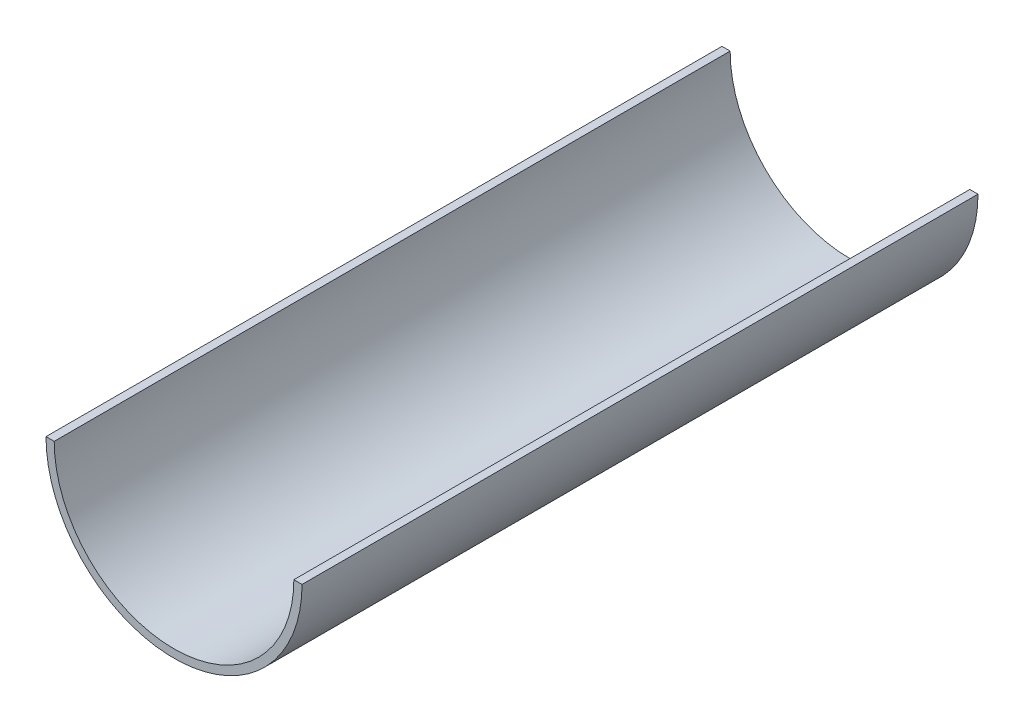
ISO-10303-21;
HEADER;
FILE_DESCRIPTION(('STEP AP214'),'2;1');
FILE_NAME('part.step','',(''),(''),'','','');
FILE_SCHEMA(('AUTOMOTIVE_DESIGN { 1 0 10303 214 1 1 1 1 }'));
ENDSEC;
DATA;
#1=APPLICATION_CONTEXT('core data for automotive mechanical design processes');
#2=APPLICATION_PROTOCOL_DEFINITION('international standard','automotive_design',2000,#1);
#3=PRODUCT_CONTEXT('',#1,'mechanical');
#4=PRODUCT('Part','Part','',(#3));
#5=PRODUCT_RELATED_PRODUCT_CATEGORY('part','',(#4));
#6=PRODUCT_DEFINITION_FORMATION('','',#4);
#7=PRODUCT_DEFINITION_CONTEXT('part definition',#1,'design');
#8=PRODUCT_DEFINITION('design','',#6,#7);
#9=PRODUCT_DEFINITION_SHAPE('','',#8);
#10=(LENGTH_UNIT() NAMED_UNIT(*) SI_UNIT(.MILLI.,.METRE.));
#11=(NAMED_UNIT(*) PLANE_ANGLE_UNIT() SI_UNIT($,.RADIAN.));
#12=(NAMED_UNIT(*) SI_UNIT($,.STERADIAN.) SOLID_ANGLE_UNIT());
#13=UNCERTAINTY_MEASURE_WITH_UNIT(LENGTH_MEASURE(1.E-05),#10,'distance_accuracy_value','');
#14=(GEOMETRIC_REPRESENTATION_CONTEXT(3) GLOBAL_UNCERTAINTY_ASSIGNED_CONTEXT((#13)) GLOBAL_UNIT_ASSIGNED_CONTEXT((#10,
#11,#12)) REPRESENTATION_CONTEXT('',''));
#15=CARTESIAN_POINT('',(0.,0.,0.));
#16=DIRECTION('',(0.,0.,1.));
#17=DIRECTION('',(1.,0.,0.));
#18=AXIS2_PLACEMENT_3D('',#15,#16,#17);
#19=CARTESIAN_POINT('',(0.,0.,330.));
#20=DIRECTION('',(0.,0.,-1.));
#21=DIRECTION('',(-1.,0.,0.));
#22=AXIS2_PLACEMENT_3D('',#19,#20,#21);
#23=CYLINDRICAL_SURFACE('',#22,62.5);
#24=CARTESIAN_POINT('',(0.,0.,0.));
#25=DIRECTION('',(0.,0.,1.));
#26=DIRECTION('',(1.,0.,0.));
#27=AXIS2_PLACEMENT_3D('',#24,#25,#26);
#28=CIRCLE('',#27,62.5);
#29=CARTESIAN_POINT('',(-62.5,0.,0.));
#30=VERTEX_POINT('',#29);
#31=CARTESIAN_POINT('',(62.5,0.,0.));
#32=VERTEX_POINT('',#31);
#33=EDGE_CURVE('E111',#30,#32,#28,.T.);
#34=ORIENTED_EDGE('',*,*,#33,.T.);
#35=DIRECTION('',(0.,0.,-1.));
#36=VECTOR('',#35,1.);
#37=CARTESIAN_POINT('',(62.5,0.,330.));
#38=LINE('',#37,#36);
#39=CARTESIAN_POINT('',(62.5,0.,330.));
#40=VERTEX_POINT('',#39);
#41=EDGE_CURVE('E11',#40,#32,#38,.T.);
#42=ORIENTED_EDGE('',*,*,#41,.F.);
#43=CARTESIAN_POINT('',(0.,0.,330.));
#44=DIRECTION('',(0.,0.,1.));
#45=DIRECTION('',(1.,0.,0.));
#46=AXIS2_PLACEMENT_3D('',#43,#44,#45);
#47=CIRCLE('',#46,62.5);
#48=CARTESIAN_POINT('',(-62.5,0.,330.));
#49=VERTEX_POINT('',#48);
#50=EDGE_CURVE('E95',#49,#40,#47,.T.);
#51=ORIENTED_EDGE('',*,*,#50,.F.);
#52=DIRECTION('',(0.,0.,-1.));
#53=VECTOR('',#52,1.);
#54=CARTESIAN_POINT('',(-62.5,0.,330.));
#55=LINE('',#54,#53);
#56=EDGE_CURVE('E107',#49,#30,#55,.T.);
#57=ORIENTED_EDGE('',*,*,#56,.T.);
#58=EDGE_LOOP('',(#34,#42,#51,#57));
#59=FACE_BOUND('',#58,.T.);
#60=ADVANCED_FACE('F43',(#59),#23,.T.);
#61=CARTESIAN_POINT('',(58.5,0.,330.));
#62=DIRECTION('',(0.,-1.,0.));
#63=DIRECTION('',(0.,0.,-1.));
#64=AXIS2_PLACEMENT_3D('',#61,#62,#63);
#65=PLANE('',#64);
#66=DIRECTION('',(-1.,0.,0.));
#67=VECTOR('',#66,1.);
#68=CARTESIAN_POINT('',(58.5,0.,0.));
#69=LINE('',#68,#67);
#70=CARTESIAN_POINT('',(58.5,0.,0.));
#71=VERTEX_POINT('',#70);
#72=EDGE_CURVE('E100',#32,#71,#69,.T.);
#73=ORIENTED_EDGE('',*,*,#72,.T.);
#74=DIRECTION('',(0.,0.,-1.));
#75=VECTOR('',#74,1.);
#76=CARTESIAN_POINT('',(58.5,0.,330.));
#77=LINE('',#76,#75);
#78=CARTESIAN_POINT('',(58.5,0.,330.));
#79=VERTEX_POINT('',#78);
#80=EDGE_CURVE('E52',#79,#71,#77,.T.);
#81=ORIENTED_EDGE('',*,*,#80,.F.);
#82=DIRECTION('',(-1.,0.,0.));
#83=VECTOR('',#82,1.);
#84=CARTESIAN_POINT('',(58.5,0.,330.));
#85=LINE('',#84,#83);
#86=EDGE_CURVE('E90',#40,#79,#85,.T.);
#87=ORIENTED_EDGE('',*,*,#86,.F.);
#88=ORIENTED_EDGE('',*,*,#41,.T.);
#89=EDGE_LOOP('',(#73,#81,#87,#88));
#90=FACE_BOUND('',#89,.T.);
#91=ADVANCED_FACE('F99',(#90),#65,.F.);
#92=CARTESIAN_POINT('',(0.,0.,330.));
#93=DIRECTION('',(0.,0.,-1.));
#94=DIRECTION('',(-1.,0.,0.));
#95=AXIS2_PLACEMENT_3D('',#92,#93,#94);
#96=CYLINDRICAL_SURFACE('',#95,58.5);
#97=CARTESIAN_POINT('',(0.,0.,0.));
#98=DIRECTION('',(0.,0.,-1.));
#99=DIRECTION('',(1.,0.,0.));
#100=AXIS2_PLACEMENT_3D('',#97,#98,#99);
#101=CIRCLE('',#100,58.5);
#102=CARTESIAN_POINT('',(-58.5,0.,0.));
#103=VERTEX_POINT('',#102);
#104=EDGE_CURVE('E77',#71,#103,#101,.T.);
#105=ORIENTED_EDGE('',*,*,#104,.T.);
#106=DIRECTION('',(0.,0.,-1.));
#107=VECTOR('',#106,1.);
#108=CARTESIAN_POINT('',(-58.5,0.,330.));
#109=LINE('',#108,#107);
#110=CARTESIAN_POINT('',(-58.5,0.,330.));
#111=VERTEX_POINT('',#110);
#112=EDGE_CURVE('E102',#111,#103,#109,.T.);
#113=ORIENTED_EDGE('',*,*,#112,.F.);
#114=CARTESIAN_POINT('',(0.,0.,330.));
#115=DIRECTION('',(0.,0.,-1.));
#116=DIRECTION('',(1.,0.,0.));
#117=AXIS2_PLACEMENT_3D('',#114,#115,#116);
#118=CIRCLE('',#117,58.5);
#119=EDGE_CURVE('E93',#79,#111,#118,.T.);
#120=ORIENTED_EDGE('',*,*,#119,.F.);
#121=ORIENTED_EDGE('',*,*,#80,.T.);
#122=EDGE_LOOP('',(#105,#113,#120,#121));
#123=FACE_BOUND('',#122,.T.);
#124=ADVANCED_FACE('F103',(#123),#96,.F.);
#125=CARTESIAN_POINT('',(-62.5,0.,330.));
#126=DIRECTION('',(0.,-1.,0.));
#127=DIRECTION('',(0.,0.,-1.));
#128=AXIS2_PLACEMENT_3D('',#125,#126,#127);
#129=PLANE('',#128);
#130=DIRECTION('',(-1.,0.,0.));
#131=VECTOR('',#130,1.);
#132=CARTESIAN_POINT('',(-62.5,0.,0.));
#133=LINE('',#132,#131);
#134=EDGE_CURVE('E83',#103,#30,#133,.T.);
#135=ORIENTED_EDGE('',*,*,#134,.T.);
#136=ORIENTED_EDGE('',*,*,#56,.F.);
#137=DIRECTION('',(-1.,0.,0.));
#138=VECTOR('',#137,1.);
#139=CARTESIAN_POINT('',(-62.5,0.,330.));
#140=LINE('',#139,#138);
#141=EDGE_CURVE('E60',#111,#49,#140,.T.);
#142=ORIENTED_EDGE('',*,*,#141,.F.);
#143=ORIENTED_EDGE('',*,*,#112,.T.);
#144=EDGE_LOOP('',(#135,#136,#142,#143));
#145=FACE_BOUND('',#144,.T.);
#146=ADVANCED_FACE('F124',(#145),#129,.F.);
#147=CARTESIAN_POINT('',(0.,0.,330.));
#148=DIRECTION('',(0.,0.,1.));
#149=DIRECTION('',(1.,0.,0.));
#150=AXIS2_PLACEMENT_3D('',#147,#148,#149);
#151=PLANE('',#150);
#152=ORIENTED_EDGE('',*,*,#50,.T.);
#153=ORIENTED_EDGE('',*,*,#86,.T.);
#154=ORIENTED_EDGE('',*,*,#119,.T.);
#155=ORIENTED_EDGE('',*,*,#141,.T.);
#156=EDGE_LOOP('',(#152,#153,#154,#155));
#157=FACE_BOUND('',#156,.T.);
#158=ADVANCED_FACE('F91',(#157),#151,.T.);
#159=CARTESIAN_POINT('',(0.,0.,0.));
#160=DIRECTION('',(0.,0.,1.));
#161=DIRECTION('',(1.,0.,0.));
#162=AXIS2_PLACEMENT_3D('',#159,#160,#161);
#163=PLANE('',#162);
#164=ORIENTED_EDGE('',*,*,#33,.F.);
#165=ORIENTED_EDGE('',*,*,#134,.F.);
#166=ORIENTED_EDGE('',*,*,#104,.F.);
#167=ORIENTED_EDGE('',*,*,#72,.F.);
#168=EDGE_LOOP('',(#164,#165,#166,#167));
#169=FACE_BOUND('',#168,.T.);
#170=ADVANCED_FACE('F127',(#169),#163,.F.);
#171=CLOSED_SHELL('',(#60,#91,#124,#146,#158,#170));
#172=MANIFOLD_SOLID_BREP('B2',#171);
#173=ADVANCED_BREP_SHAPE_REPRESENTATION('',(#18,#172),#14);
#174=SHAPE_DEFINITION_REPRESENTATION(#9,#173);
ENDSEC;
END-ISO-10303-21;
